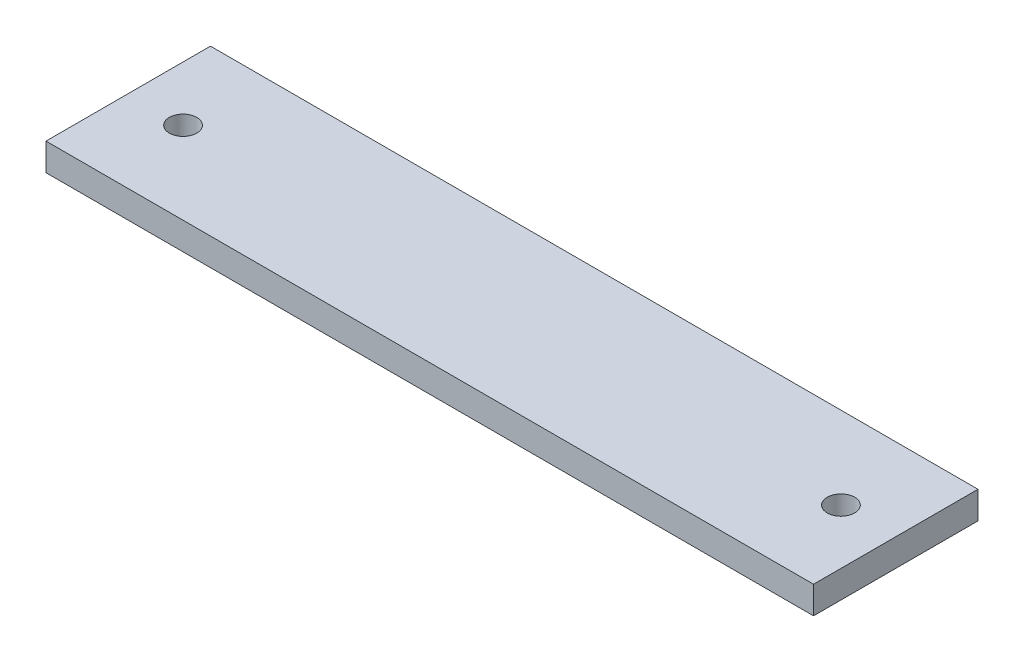
ISO-10303-21;
HEADER;
FILE_DESCRIPTION(('STEP AP214'),'2;1');
FILE_NAME('part.step','',(''),(''),'','','');
FILE_SCHEMA(('AUTOMOTIVE_DESIGN { 1 0 10303 214 1 1 1 1 }'));
ENDSEC;
DATA;
#1=APPLICATION_CONTEXT('core data for automotive mechanical design processes');
#2=APPLICATION_PROTOCOL_DEFINITION('international standard','automotive_design',2000,#1);
#3=PRODUCT_CONTEXT('',#1,'mechanical');
#4=PRODUCT('Part','Part','',(#3));
#5=PRODUCT_RELATED_PRODUCT_CATEGORY('part','',(#4));
#6=PRODUCT_DEFINITION_FORMATION('','',#4);
#7=PRODUCT_DEFINITION_CONTEXT('part definition',#1,'design');
#8=PRODUCT_DEFINITION('design','',#6,#7);
#9=PRODUCT_DEFINITION_SHAPE('','',#8);
#10=(LENGTH_UNIT() NAMED_UNIT(*) SI_UNIT(.MILLI.,.METRE.));
#11=(NAMED_UNIT(*) PLANE_ANGLE_UNIT() SI_UNIT($,.RADIAN.));
#12=(NAMED_UNIT(*) SI_UNIT($,.STERADIAN.) SOLID_ANGLE_UNIT());
#13=UNCERTAINTY_MEASURE_WITH_UNIT(LENGTH_MEASURE(1.E-05),#10,'distance_accuracy_value','');
#14=(GEOMETRIC_REPRESENTATION_CONTEXT(3) GLOBAL_UNCERTAINTY_ASSIGNED_CONTEXT((#13)) GLOBAL_UNIT_ASSIGNED_CONTEXT((#10,
#11,#12)) REPRESENTATION_CONTEXT('',''));
#15=CARTESIAN_POINT('',(0.,0.,0.));
#16=DIRECTION('',(0.,0.,1.));
#17=DIRECTION('',(1.,0.,0.));
#18=AXIS2_PLACEMENT_3D('',#15,#16,#17);
#19=CARTESIAN_POINT('',(0.,5.,0.));
#20=DIRECTION('',(0.,1.,0.));
#21=DIRECTION('',(0.,0.,1.));
#22=AXIS2_PLACEMENT_3D('',#19,#20,#21);
#23=PLANE('',#22);
#24=CARTESIAN_POINT('',(-56.8548387096774,5.,-1.57258064516129));
#25=DIRECTION('',(0.,1.,0.));
#26=DIRECTION('',(0.,0.,1.));
#27=AXIS2_PLACEMENT_3D('',#24,#25,#26);
#28=CIRCLE('',#27,2.49999999999999);
#29=CARTESIAN_POINT('',(-56.8548387096774,5.,0.927419354838705));
#30=VERTEX_POINT('',#29);
#31=EDGE_CURVE('E100',#30,#30,#28,.T.);
#32=ORIENTED_EDGE('',*,*,#31,.F.);
#33=EDGE_LOOP('',(#32));
#34=FACE_BOUND('',#33,.T.);
#35=DIRECTION('',(0.,0.,1.));
#36=VECTOR('',#35,1.);
#37=CARTESIAN_POINT('',(-66.8548387096774,5.,-16.5725806451613));
#38=LINE('',#37,#36);
#39=CARTESIAN_POINT('',(-66.8548387096774,5.,-16.5725806451613));
#40=VERTEX_POINT('',#39);
#41=CARTESIAN_POINT('',(-66.8548387096774,5.,13.4274193548387));
#42=VERTEX_POINT('',#41);
#43=EDGE_CURVE('E85',#40,#42,#38,.T.);
#44=ORIENTED_EDGE('',*,*,#43,.T.);
#45=DIRECTION('',(1.,0.,0.));
#46=VECTOR('',#45,1.);
#47=CARTESIAN_POINT('',(-66.8548387096774,5.,13.4274193548387));
#48=LINE('',#47,#46);
#49=CARTESIAN_POINT('',(73.1451612903226,5.,13.4274193548387));
#50=VERTEX_POINT('',#49);
#51=EDGE_CURVE('E80',#42,#50,#48,.T.);
#52=ORIENTED_EDGE('',*,*,#51,.T.);
#53=DIRECTION('',(0.,0.,-1.));
#54=VECTOR('',#53,1.);
#55=CARTESIAN_POINT('',(73.1451612903226,5.,-16.5725806451613));
#56=LINE('',#55,#54);
#57=CARTESIAN_POINT('',(73.1451612903226,5.,-16.5725806451613));
#58=VERTEX_POINT('',#57);
#59=EDGE_CURVE('E83',#50,#58,#56,.T.);
#60=ORIENTED_EDGE('',*,*,#59,.T.);
#61=DIRECTION('',(-1.,0.,0.));
#62=VECTOR('',#61,1.);
#63=CARTESIAN_POINT('',(-66.8548387096774,5.,-16.5725806451613));
#64=LINE('',#63,#62);
#65=EDGE_CURVE('E50',#58,#40,#64,.T.);
#66=ORIENTED_EDGE('',*,*,#65,.T.);
#67=EDGE_LOOP('',(#44,#52,#60,#66));
#68=FACE_BOUND('',#67,.T.);
#69=CARTESIAN_POINT('',(63.1451612903226,5.,-1.57258064516129));
#70=DIRECTION('',(0.,1.,0.));
#71=DIRECTION('',(0.,0.,-1.));
#72=AXIS2_PLACEMENT_3D('',#69,#70,#71);
#73=CIRCLE('',#72,2.5);
#74=CARTESIAN_POINT('',(63.1451612903226,5.,-4.07258064516128));
#75=VERTEX_POINT('',#74);
#76=EDGE_CURVE('E115',#75,#75,#73,.T.);
#77=ORIENTED_EDGE('',*,*,#76,.F.);
#78=EDGE_LOOP('',(#77));
#79=FACE_BOUND('',#78,.T.);
#80=ADVANCED_FACE('F33',(#34,#68,#79),#23,.T.);
#81=CARTESIAN_POINT('',(0.,0.,0.));
#82=DIRECTION('',(0.,1.,0.));
#83=DIRECTION('',(0.,0.,1.));
#84=AXIS2_PLACEMENT_3D('',#81,#82,#83);
#85=PLANE('',#84);
#86=DIRECTION('',(0.,0.,1.));
#87=VECTOR('',#86,1.);
#88=CARTESIAN_POINT('',(-66.8548387096774,0.,-16.5725806451613));
#89=LINE('',#88,#87);
#90=CARTESIAN_POINT('',(-66.8548387096774,0.,-16.5725806451613));
#91=VERTEX_POINT('',#90);
#92=CARTESIAN_POINT('',(-66.8548387096774,0.,13.4274193548387));
#93=VERTEX_POINT('',#92);
#94=EDGE_CURVE('E97',#91,#93,#89,.T.);
#95=ORIENTED_EDGE('',*,*,#94,.F.);
#96=DIRECTION('',(-1.,0.,0.));
#97=VECTOR('',#96,1.);
#98=CARTESIAN_POINT('',(-66.8548387096774,0.,-16.5725806451613));
#99=LINE('',#98,#97);
#100=CARTESIAN_POINT('',(73.1451612903226,0.,-16.5725806451613));
#101=VERTEX_POINT('',#100);
#102=EDGE_CURVE('E73',#101,#91,#99,.T.);
#103=ORIENTED_EDGE('',*,*,#102,.F.);
#104=DIRECTION('',(0.,0.,-1.));
#105=VECTOR('',#104,1.);
#106=CARTESIAN_POINT('',(73.1451612903226,0.,-16.5725806451613));
#107=LINE('',#106,#105);
#108=CARTESIAN_POINT('',(73.1451612903226,0.,13.4274193548387));
#109=VERTEX_POINT('',#108);
#110=EDGE_CURVE('E67',#109,#101,#107,.T.);
#111=ORIENTED_EDGE('',*,*,#110,.F.);
#112=DIRECTION('',(1.,0.,0.));
#113=VECTOR('',#112,1.);
#114=CARTESIAN_POINT('',(-66.8548387096774,0.,13.4274193548387));
#115=LINE('',#114,#113);
#116=EDGE_CURVE('E89',#93,#109,#115,.T.);
#117=ORIENTED_EDGE('',*,*,#116,.F.);
#118=EDGE_LOOP('',(#95,#103,#111,#117));
#119=FACE_BOUND('',#118,.T.);
#120=CARTESIAN_POINT('',(-56.8548387096774,0.,-1.57258064516129));
#121=DIRECTION('',(0.,1.,0.));
#122=DIRECTION('',(0.,0.,1.));
#123=AXIS2_PLACEMENT_3D('',#120,#121,#122);
#124=CIRCLE('',#123,2.49999999999999);
#125=CARTESIAN_POINT('',(-56.8548387096774,0.,0.927419354838705));
#126=VERTEX_POINT('',#125);
#127=EDGE_CURVE('E112',#126,#126,#124,.T.);
#128=ORIENTED_EDGE('',*,*,#127,.T.);
#129=EDGE_LOOP('',(#128));
#130=FACE_BOUND('',#129,.T.);
#131=CARTESIAN_POINT('',(63.1451612903226,0.,-1.57258064516129));
#132=DIRECTION('',(0.,1.,0.));
#133=DIRECTION('',(0.,0.,-1.));
#134=AXIS2_PLACEMENT_3D('',#131,#132,#133);
#135=CIRCLE('',#134,2.5);
#136=CARTESIAN_POINT('',(63.1451612903226,0.,-4.07258064516128));
#137=VERTEX_POINT('',#136);
#138=EDGE_CURVE('E118',#137,#137,#135,.T.);
#139=ORIENTED_EDGE('',*,*,#138,.T.);
#140=EDGE_LOOP('',(#139));
#141=FACE_BOUND('',#140,.T.);
#142=ADVANCED_FACE('F108',(#119,#130,#141),#85,.F.);
#143=CARTESIAN_POINT('',(-66.8548387096774,5.,-16.5725806451613));
#144=DIRECTION('',(1.,0.,0.));
#145=DIRECTION('',(0.,0.,-1.));
#146=AXIS2_PLACEMENT_3D('',#143,#144,#145);
#147=PLANE('',#146);
#148=ORIENTED_EDGE('',*,*,#94,.T.);
#149=DIRECTION('',(0.,-1.,0.));
#150=VECTOR('',#149,1.);
#151=CARTESIAN_POINT('',(-66.8548387096774,5.,13.4274193548387));
#152=LINE('',#151,#150);
#153=EDGE_CURVE('E11',#42,#93,#152,.T.);
#154=ORIENTED_EDGE('',*,*,#153,.F.);
#155=ORIENTED_EDGE('',*,*,#43,.F.);
#156=DIRECTION('',(0.,-1.,0.));
#157=VECTOR('',#156,1.);
#158=CARTESIAN_POINT('',(-66.8548387096774,5.,-16.5725806451613));
#159=LINE('',#158,#157);
#160=EDGE_CURVE('E93',#40,#91,#159,.T.);
#161=ORIENTED_EDGE('',*,*,#160,.T.);
#162=EDGE_LOOP('',(#148,#154,#155,#161));
#163=FACE_BOUND('',#162,.T.);
#164=ADVANCED_FACE('F35',(#163),#147,.F.);
#165=CARTESIAN_POINT('',(-66.8548387096774,5.,13.4274193548387));
#166=DIRECTION('',(0.,0.,-1.));
#167=DIRECTION('',(-1.,0.,0.));
#168=AXIS2_PLACEMENT_3D('',#165,#166,#167);
#169=PLANE('',#168);
#170=ORIENTED_EDGE('',*,*,#116,.T.);
#171=DIRECTION('',(0.,-1.,0.));
#172=VECTOR('',#171,1.);
#173=CARTESIAN_POINT('',(73.1451612903226,5.,13.4274193548387));
#174=LINE('',#173,#172);
#175=EDGE_CURVE('E42',#50,#109,#174,.T.);
#176=ORIENTED_EDGE('',*,*,#175,.F.);
#177=ORIENTED_EDGE('',*,*,#51,.F.);
#178=ORIENTED_EDGE('',*,*,#153,.T.);
#179=EDGE_LOOP('',(#170,#176,#177,#178));
#180=FACE_BOUND('',#179,.T.);
#181=ADVANCED_FACE('F88',(#180),#169,.F.);
#182=CARTESIAN_POINT('',(73.1451612903226,5.,-16.5725806451613));
#183=DIRECTION('',(-1.,0.,0.));
#184=DIRECTION('',(0.,0.,1.));
#185=AXIS2_PLACEMENT_3D('',#182,#183,#184);
#186=PLANE('',#185);
#187=ORIENTED_EDGE('',*,*,#110,.T.);
#188=DIRECTION('',(0.,-1.,0.));
#189=VECTOR('',#188,1.);
#190=CARTESIAN_POINT('',(73.1451612903226,5.,-16.5725806451613));
#191=LINE('',#190,#189);
#192=EDGE_CURVE('E90',#58,#101,#191,.T.);
#193=ORIENTED_EDGE('',*,*,#192,.F.);
#194=ORIENTED_EDGE('',*,*,#59,.F.);
#195=ORIENTED_EDGE('',*,*,#175,.T.);
#196=EDGE_LOOP('',(#187,#193,#194,#195));
#197=FACE_BOUND('',#196,.T.);
#198=ADVANCED_FACE('F91',(#197),#186,.F.);
#199=CARTESIAN_POINT('',(-66.8548387096774,5.,-16.5725806451613));
#200=DIRECTION('',(0.,0.,1.));
#201=DIRECTION('',(1.,0.,0.));
#202=AXIS2_PLACEMENT_3D('',#199,#200,#201);
#203=PLANE('',#202);
#204=ORIENTED_EDGE('',*,*,#102,.T.);
#205=ORIENTED_EDGE('',*,*,#160,.F.);
#206=ORIENTED_EDGE('',*,*,#65,.F.);
#207=ORIENTED_EDGE('',*,*,#192,.T.);
#208=EDGE_LOOP('',(#204,#205,#206,#207));
#209=FACE_BOUND('',#208,.T.);
#210=ADVANCED_FACE('F105',(#209),#203,.F.);
#211=CARTESIAN_POINT('',(-56.8548387096774,5.,-1.57258064516129));
#212=DIRECTION('',(0.,-1.,0.));
#213=DIRECTION('',(0.,0.,-1.));
#214=AXIS2_PLACEMENT_3D('',#211,#212,#213);
#215=CYLINDRICAL_SURFACE('',#214,2.49999999999999);
#216=ORIENTED_EDGE('',*,*,#31,.T.);
#217=EDGE_LOOP('',(#216));
#218=FACE_BOUND('',#217,.T.);
#219=ORIENTED_EDGE('',*,*,#127,.F.);
#220=EDGE_LOOP('',(#219));
#221=FACE_BOUND('',#220,.T.);
#222=ADVANCED_FACE('F135',(#218,#221),#215,.F.);
#223=CARTESIAN_POINT('',(63.1451612903226,5.,-1.57258064516129));
#224=DIRECTION('',(0.,-1.,0.));
#225=DIRECTION('',(0.,0.,-1.));
#226=AXIS2_PLACEMENT_3D('',#223,#224,#225);
#227=CYLINDRICAL_SURFACE('',#226,2.5);
#228=ORIENTED_EDGE('',*,*,#76,.T.);
#229=EDGE_LOOP('',(#228));
#230=FACE_BOUND('',#229,.T.);
#231=ORIENTED_EDGE('',*,*,#138,.F.);
#232=EDGE_LOOP('',(#231));
#233=FACE_BOUND('',#232,.T.);
#234=ADVANCED_FACE('F124',(#230,#233),#227,.F.);
#235=CLOSED_SHELL('',(#80,#142,#164,#181,#198,#210,#222,#234));
#236=MANIFOLD_SOLID_BREP('B2',#235);
#237=ADVANCED_BREP_SHAPE_REPRESENTATION('',(#18,#236),#14);
#238=SHAPE_DEFINITION_REPRESENTATION(#9,#237);
ENDSEC;
END-ISO-10303-21;
